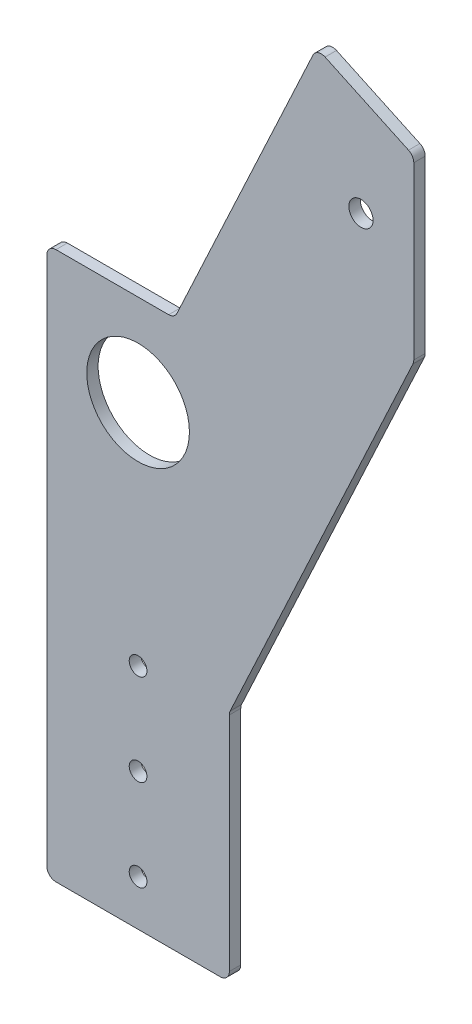
ISO-10303-21;
HEADER;
FILE_DESCRIPTION(('STEP AP214'),'2;1');
FILE_NAME('part.step','',(''),(''),'','','');
FILE_SCHEMA(('AUTOMOTIVE_DESIGN { 1 0 10303 214 1 1 1 1 }'));
ENDSEC;
DATA;
#1=APPLICATION_CONTEXT('core data for automotive mechanical design processes');
#2=APPLICATION_PROTOCOL_DEFINITION('international standard','automotive_design',2000,#1);
#3=PRODUCT_CONTEXT('',#1,'mechanical');
#4=PRODUCT('Part','Part','',(#3));
#5=PRODUCT_RELATED_PRODUCT_CATEGORY('part','',(#4));
#6=PRODUCT_DEFINITION_FORMATION('','',#4);
#7=PRODUCT_DEFINITION_CONTEXT('part definition',#1,'design');
#8=PRODUCT_DEFINITION('design','',#6,#7);
#9=PRODUCT_DEFINITION_SHAPE('','',#8);
#10=(LENGTH_UNIT() NAMED_UNIT(*) SI_UNIT(.MILLI.,.METRE.));
#11=(NAMED_UNIT(*) PLANE_ANGLE_UNIT() SI_UNIT($,.RADIAN.));
#12=(NAMED_UNIT(*) SI_UNIT($,.STERADIAN.) SOLID_ANGLE_UNIT());
#13=UNCERTAINTY_MEASURE_WITH_UNIT(LENGTH_MEASURE(1.E-05),#10,'distance_accuracy_value','');
#14=(GEOMETRIC_REPRESENTATION_CONTEXT(3) GLOBAL_UNCERTAINTY_ASSIGNED_CONTEXT((#13)) GLOBAL_UNIT_ASSIGNED_CONTEXT((#10,
#11,#12)) REPRESENTATION_CONTEXT('',''));
#15=CARTESIAN_POINT('',(0.,0.,0.));
#16=DIRECTION('',(0.,0.,1.));
#17=DIRECTION('',(1.,0.,0.));
#18=AXIS2_PLACEMENT_3D('',#15,#16,#17);
#19=CARTESIAN_POINT('',(0.,114.3,3.175));
#20=DIRECTION('',(0.,1.,0.));
#21=DIRECTION('',(0.,0.,1.));
#22=AXIS2_PLACEMENT_3D('',#19,#20,#21);
#23=PLANE('',#22);
#24=DIRECTION('',(1.,0.,0.));
#25=VECTOR('',#24,1.);
#26=CARTESIAN_POINT('',(0.,114.3,3.175));
#27=LINE('',#26,#25);
#28=CARTESIAN_POINT('',(-22.86,114.3,3.175));
#29=VERTEX_POINT('',#28);
#30=CARTESIAN_POINT('',(8.51448508895965,114.3,3.175));
#31=VERTEX_POINT('',#30);
#32=EDGE_CURVE('E273',#29,#31,#27,.T.);
#33=ORIENTED_EDGE('',*,*,#32,.T.);
#34=DIRECTION('',(0.,0.,-1.));
#35=VECTOR('',#34,1.);
#36=CARTESIAN_POINT('',(8.51448508895965,114.3,0.));
#37=LINE('',#36,#35);
#38=CARTESIAN_POINT('',(8.51448508895965,114.3,0.));
#39=VERTEX_POINT('',#38);
#40=EDGE_CURVE('E168',#31,#39,#37,.T.);
#41=ORIENTED_EDGE('',*,*,#40,.T.);
#42=DIRECTION('',(1.,0.,0.));
#43=VECTOR('',#42,1.);
#44=CARTESIAN_POINT('',(0.,114.3,0.));
#45=LINE('',#44,#43);
#46=CARTESIAN_POINT('',(-22.86,114.3,0.));
#47=VERTEX_POINT('',#46);
#48=EDGE_CURVE('E152',#47,#39,#45,.T.);
#49=ORIENTED_EDGE('',*,*,#48,.F.);
#50=DIRECTION('',(0.,0.,-1.));
#51=VECTOR('',#50,1.);
#52=CARTESIAN_POINT('',(-22.86,114.3,3.175));
#53=LINE('',#52,#51);
#54=EDGE_CURVE('E165',#47,#29,#53,.F.);
#55=ORIENTED_EDGE('',*,*,#54,.T.);
#56=EDGE_LOOP('',(#33,#41,#49,#55));
#57=FACE_BOUND('',#56,.T.);
#58=ADVANCED_FACE('F35',(#57),#23,.T.);
#59=CARTESIAN_POINT('',(-25.4,0.,3.175));
#60=DIRECTION('',(-1.,0.,0.));
#61=DIRECTION('',(0.,0.,1.));
#62=AXIS2_PLACEMENT_3D('',#59,#60,#61);
#63=PLANE('',#62);
#64=DIRECTION('',(0.,1.,0.));
#65=VECTOR('',#64,1.);
#66=CARTESIAN_POINT('',(-25.4,0.,3.175));
#67=LINE('',#66,#65);
#68=CARTESIAN_POINT('',(-25.4,-35.56,3.175));
#69=VERTEX_POINT('',#68);
#70=CARTESIAN_POINT('',(-25.4,111.76,3.175));
#71=VERTEX_POINT('',#70);
#72=EDGE_CURVE('E275',#69,#71,#67,.T.);
#73=ORIENTED_EDGE('',*,*,#72,.T.);
#74=DIRECTION('',(0.,0.,-1.));
#75=VECTOR('',#74,1.);
#76=CARTESIAN_POINT('',(-25.4,111.76,3.175));
#77=LINE('',#76,#75);
#78=CARTESIAN_POINT('',(-25.4,111.76,0.));
#79=VERTEX_POINT('',#78);
#80=EDGE_CURVE('E191',#71,#79,#77,.T.);
#81=ORIENTED_EDGE('',*,*,#80,.T.);
#82=DIRECTION('',(0.,1.,0.));
#83=VECTOR('',#82,1.);
#84=CARTESIAN_POINT('',(-25.4,0.,0.));
#85=LINE('',#84,#83);
#86=CARTESIAN_POINT('',(-25.4,-35.56,0.));
#87=VERTEX_POINT('',#86);
#88=EDGE_CURVE('E154',#87,#79,#85,.T.);
#89=ORIENTED_EDGE('',*,*,#88,.F.);
#90=DIRECTION('',(0.,0.,-1.));
#91=VECTOR('',#90,1.);
#92=CARTESIAN_POINT('',(-25.4,-35.56,3.175));
#93=LINE('',#92,#91);
#94=EDGE_CURVE('E189',#87,#69,#93,.F.);
#95=ORIENTED_EDGE('',*,*,#94,.T.);
#96=EDGE_LOOP('',(#73,#81,#89,#95));
#97=FACE_BOUND('',#96,.T.);
#98=ADVANCED_FACE('F300',(#97),#63,.T.);
#99=CARTESIAN_POINT('',(0.,-38.1,3.175));
#100=DIRECTION('',(0.,1.,0.));
#101=DIRECTION('',(0.,0.,1.));
#102=AXIS2_PLACEMENT_3D('',#99,#100,#101);
#103=PLANE('',#102);
#104=DIRECTION('',(1.,0.,0.));
#105=VECTOR('',#104,1.);
#106=CARTESIAN_POINT('',(0.,-38.1,3.175));
#107=LINE('',#106,#105);
#108=CARTESIAN_POINT('',(-22.86,-38.1,3.175));
#109=VERTEX_POINT('',#108);
#110=CARTESIAN_POINT('',(22.86,-38.1,3.175));
#111=VERTEX_POINT('',#110);
#112=EDGE_CURVE('E261',#109,#111,#107,.T.);
#113=ORIENTED_EDGE('',*,*,#112,.F.);
#114=DIRECTION('',(0.,0.,-1.));
#115=VECTOR('',#114,1.);
#116=CARTESIAN_POINT('',(-22.86,-38.1,0.));
#117=LINE('',#116,#115);
#118=CARTESIAN_POINT('',(-22.86,-38.1,0.));
#119=VERTEX_POINT('',#118);
#120=EDGE_CURVE('E213',#109,#119,#117,.T.);
#121=ORIENTED_EDGE('',*,*,#120,.T.);
#122=DIRECTION('',(1.,0.,0.));
#123=VECTOR('',#122,1.);
#124=CARTESIAN_POINT('',(0.,-38.1,0.));
#125=LINE('',#124,#123);
#126=CARTESIAN_POINT('',(22.86,-38.1,0.));
#127=VERTEX_POINT('',#126);
#128=EDGE_CURVE('E251',#119,#127,#125,.T.);
#129=ORIENTED_EDGE('',*,*,#128,.T.);
#130=DIRECTION('',(0.,0.,-1.));
#131=VECTOR('',#130,1.);
#132=CARTESIAN_POINT('',(22.86,-38.1,3.175));
#133=LINE('',#132,#131);
#134=EDGE_CURVE('E211',#127,#111,#133,.F.);
#135=ORIENTED_EDGE('',*,*,#134,.T.);
#136=EDGE_LOOP('',(#113,#121,#129,#135));
#137=FACE_BOUND('',#136,.T.);
#138=ADVANCED_FACE('F295',(#137),#103,.F.);
#139=CARTESIAN_POINT('',(25.4,0.,3.175));
#140=DIRECTION('',(-1.,0.,0.));
#141=DIRECTION('',(0.,0.,1.));
#142=AXIS2_PLACEMENT_3D('',#139,#140,#141);
#143=PLANE('',#142);
#144=DIRECTION('',(0.,1.,0.));
#145=VECTOR('',#144,1.);
#146=CARTESIAN_POINT('',(25.4,0.,3.175));
#147=LINE('',#146,#145);
#148=CARTESIAN_POINT('',(25.4,-35.56,3.175));
#149=VERTEX_POINT('',#148);
#150=CARTESIAN_POINT('',(25.4,26.2748066946256,3.175));
#151=VERTEX_POINT('',#150);
#152=EDGE_CURVE('E257',#149,#151,#147,.T.);
#153=ORIENTED_EDGE('',*,*,#152,.F.);
#154=DIRECTION('',(0.,0.,-1.));
#155=VECTOR('',#154,1.);
#156=CARTESIAN_POINT('',(25.4,-35.56,3.175));
#157=LINE('',#156,#155);
#158=CARTESIAN_POINT('',(25.4,-35.56,0.));
#159=VERTEX_POINT('',#158);
#160=EDGE_CURVE('E218',#149,#159,#157,.T.);
#161=ORIENTED_EDGE('',*,*,#160,.T.);
#162=DIRECTION('',(0.,1.,0.));
#163=VECTOR('',#162,1.);
#164=CARTESIAN_POINT('',(25.4,0.,0.));
#165=LINE('',#164,#163);
#166=CARTESIAN_POINT('',(25.4,26.2748066946256,0.));
#167=VERTEX_POINT('',#166);
#168=EDGE_CURVE('E241',#159,#167,#165,.T.);
#169=ORIENTED_EDGE('',*,*,#168,.T.);
#170=DIRECTION('',(0.,0.,-1.));
#171=VECTOR('',#170,1.);
#172=CARTESIAN_POINT('',(25.4,26.2748066946256,3.175));
#173=LINE('',#172,#171);
#174=EDGE_CURVE('E216',#167,#151,#173,.F.);
#175=ORIENTED_EDGE('',*,*,#174,.T.);
#176=EDGE_LOOP('',(#153,#161,#169,#175));
#177=FACE_BOUND('',#176,.T.);
#178=ADVANCED_FACE('F249',(#177),#143,.F.);
#179=CARTESIAN_POINT('',(10.5838862970263,-4.93534723334508,3.175));
#180=DIRECTION('',(-0.906307787036651,0.422618261740697,0.));
#181=DIRECTION('',(-0.422618261740697,-0.906307787036651,0.));
#182=AXIS2_PLACEMENT_3D('',#179,#180,#181);
#183=PLANE('',#182);
#184=DIRECTION('',(0.422618261740697,0.906307787036651,0.));
#185=VECTOR('',#184,1.);
#186=CARTESIAN_POINT('',(10.5838862970263,-4.93534723334508,3.175));
#187=LINE('',#186,#185);
#188=CARTESIAN_POINT('',(25.6379782209269,27.348257079447,3.175));
#189=VERTEX_POINT('',#188);
#190=CARTESIAN_POINT('',(76.4939842980309,136.409314061273,3.175));
#191=VERTEX_POINT('',#190);
#192=EDGE_CURVE('E256',#189,#191,#187,.T.);
#193=ORIENTED_EDGE('',*,*,#192,.F.);
#194=DIRECTION('',(0.,0.,-1.));
#195=VECTOR('',#194,1.);
#196=CARTESIAN_POINT('',(25.6379782209269,27.348257079447,0.));
#197=LINE('',#196,#195);
#198=CARTESIAN_POINT('',(25.6379782209269,27.348257079447,0.));
#199=VERTEX_POINT('',#198);
#200=EDGE_CURVE('E223',#189,#199,#197,.T.);
#201=ORIENTED_EDGE('',*,*,#200,.T.);
#202=DIRECTION('',(0.422618261740697,0.906307787036651,0.));
#203=VECTOR('',#202,1.);
#204=CARTESIAN_POINT('',(10.5838862970263,-4.93534723334508,0.));
#205=LINE('',#204,#203);
#206=CARTESIAN_POINT('',(76.4939842980309,136.409314061273,0.));
#207=VERTEX_POINT('',#206);
#208=EDGE_CURVE('E243',#199,#207,#205,.T.);
#209=ORIENTED_EDGE('',*,*,#208,.T.);
#210=DIRECTION('',(0.,0.,1.));
#211=VECTOR('',#210,1.);
#212=CARTESIAN_POINT('',(76.4939842980309,136.409314061273,3.175));
#213=LINE('',#212,#211);
#214=EDGE_CURVE('E221',#207,#191,#213,.T.);
#215=ORIENTED_EDGE('',*,*,#214,.T.);
#216=EDGE_LOOP('',(#193,#201,#209,#215));
#217=FACE_BOUND('',#216,.T.);
#218=ADVANCED_FACE('F255',(#217),#183,.F.);
#219=CARTESIAN_POINT('',(85.1980762219313,182.707864072034,3.175));
#220=DIRECTION('',(0.422618261740696,0.906307787036651,0.));
#221=DIRECTION('',(-0.906307787036651,0.422618261740696,0.));
#222=AXIS2_PLACEMENT_3D('',#219,#220,#221);
#223=PLANE('',#222);
#224=DIRECTION('',(0.906307787036651,-0.422618261740696,0.));
#225=VECTOR('',#224,1.);
#226=CARTESIAN_POINT('',(85.1980762219313,182.707864072034,3.175));
#227=LINE('',#226,#225);
#228=CARTESIAN_POINT('',(52.0435487165691,198.168074150295,3.175));
#229=VERTEX_POINT('',#228);
#230=CARTESIAN_POINT('',(75.2654129037792,187.339541043164,3.175));
#231=VERTEX_POINT('',#230);
#232=EDGE_CURVE('E179',#229,#231,#227,.T.);
#233=ORIENTED_EDGE('',*,*,#232,.T.);
#234=DIRECTION('',(0.,0.,1.));
#235=VECTOR('',#234,1.);
#236=CARTESIAN_POINT('',(75.2654129037792,187.339541043164,0.));
#237=LINE('',#236,#235);
#238=CARTESIAN_POINT('',(75.2654129037792,187.339541043164,0.));
#239=VERTEX_POINT('',#238);
#240=EDGE_CURVE('E233',#231,#239,#237,.F.);
#241=ORIENTED_EDGE('',*,*,#240,.T.);
#242=DIRECTION('',(0.906307787036651,-0.422618261740696,0.));
#243=VECTOR('',#242,1.);
#244=CARTESIAN_POINT('',(85.1980762219313,182.707864072034,0.));
#245=LINE('',#244,#243);
#246=CARTESIAN_POINT('',(52.0435487165691,198.168074150295,0.));
#247=VERTEX_POINT('',#246);
#248=EDGE_CURVE('E268',#247,#239,#245,.T.);
#249=ORIENTED_EDGE('',*,*,#248,.F.);
#250=DIRECTION('',(0.,0.,-1.));
#251=VECTOR('',#250,1.);
#252=CARTESIAN_POINT('',(52.0435487165691,198.168074150295,3.175));
#253=LINE('',#252,#251);
#254=EDGE_CURVE('E231',#247,#229,#253,.F.);
#255=ORIENTED_EDGE('',*,*,#254,.T.);
#256=EDGE_LOOP('',(#233,#241,#249,#255));
#257=FACE_BOUND('',#256,.T.);
#258=ADVANCED_FACE('F313',(#257),#223,.T.);
#259=CARTESIAN_POINT('',(-35.4565492844356,16.5336604630823,3.175));
#260=DIRECTION('',(-0.906307787036651,0.422618261740697,0.));
#261=DIRECTION('',(-0.422618261740697,-0.906307787036651,0.));
#262=AXIS2_PLACEMENT_3D('',#259,#260,#261);
#263=PLANE('',#262);
#264=DIRECTION('',(0.422618261740697,0.906307787036651,0.));
#265=VECTOR('',#264,1.);
#266=CARTESIAN_POINT('',(-35.4565492844356,16.5336604630823,0.));
#267=LINE('',#266,#265);
#268=CARTESIAN_POINT('',(10.8165068680327,115.766549615179,0.));
#269=VERTEX_POINT('',#268);
#270=CARTESIAN_POINT('',(48.6680765526746,196.939502756043,0.));
#271=VERTEX_POINT('',#270);
#272=EDGE_CURVE('E182',#269,#271,#267,.T.);
#273=ORIENTED_EDGE('',*,*,#272,.F.);
#274=DIRECTION('',(0.,0.,-1.));
#275=VECTOR('',#274,1.);
#276=CARTESIAN_POINT('',(10.8165068680327,115.766549615179,3.175));
#277=LINE('',#276,#275);
#278=CARTESIAN_POINT('',(10.8165068680327,115.766549615179,3.175));
#279=VERTEX_POINT('',#278);
#280=EDGE_CURVE('E187',#269,#279,#277,.F.);
#281=ORIENTED_EDGE('',*,*,#280,.T.);
#282=DIRECTION('',(0.422618261740697,0.906307787036651,0.));
#283=VECTOR('',#282,1.);
#284=CARTESIAN_POINT('',(-35.4565492844356,16.5336604630823,3.175));
#285=LINE('',#284,#283);
#286=CARTESIAN_POINT('',(48.6680765526746,196.939502756043,3.175));
#287=VERTEX_POINT('',#286);
#288=EDGE_CURVE('E174',#279,#287,#285,.T.);
#289=ORIENTED_EDGE('',*,*,#288,.T.);
#290=DIRECTION('',(0.,0.,-1.));
#291=VECTOR('',#290,1.);
#292=CARTESIAN_POINT('',(48.6680765526746,196.939502756043,3.175));
#293=LINE('',#292,#291);
#294=EDGE_CURVE('E176',#287,#271,#293,.T.);
#295=ORIENTED_EDGE('',*,*,#294,.T.);
#296=EDGE_LOOP('',(#273,#281,#289,#295));
#297=FACE_BOUND('',#296,.T.);
#298=ADVANCED_FACE('F307',(#297),#263,.T.);
#299=CARTESIAN_POINT('',(0.,0.,3.175));
#300=DIRECTION('',(0.,0.,1.));
#301=DIRECTION('',(1.,0.,0.));
#302=AXIS2_PLACEMENT_3D('',#299,#300,#301);
#303=PLANE('',#302);
#304=ORIENTED_EDGE('',*,*,#32,.F.);
#305=CARTESIAN_POINT('',(-22.86,111.76,3.175));
#306=DIRECTION('',(0.,0.,1.));
#307=DIRECTION('',(1.,0.,0.));
#308=AXIS2_PLACEMENT_3D('',#305,#306,#307);
#309=CIRCLE('',#308,2.54);
#310=EDGE_CURVE('E173',#29,#71,#309,.T.);
#311=ORIENTED_EDGE('',*,*,#310,.T.);
#312=ORIENTED_EDGE('',*,*,#72,.F.);
#313=CARTESIAN_POINT('',(-22.86,-35.56,3.175));
#314=DIRECTION('',(0.,0.,1.));
#315=DIRECTION('',(1.,0.,0.));
#316=AXIS2_PLACEMENT_3D('',#313,#314,#315);
#317=CIRCLE('',#316,2.54);
#318=EDGE_CURVE('E208',#69,#109,#317,.T.);
#319=ORIENTED_EDGE('',*,*,#318,.T.);
#320=ORIENTED_EDGE('',*,*,#112,.T.);
#321=CARTESIAN_POINT('',(22.86,-35.56,3.175));
#322=DIRECTION('',(0.,0.,1.));
#323=DIRECTION('',(1.,0.,0.));
#324=AXIS2_PLACEMENT_3D('',#321,#322,#323);
#325=CIRCLE('',#324,2.54);
#326=EDGE_CURVE('E206',#111,#149,#325,.T.);
#327=ORIENTED_EDGE('',*,*,#326,.T.);
#328=ORIENTED_EDGE('',*,*,#152,.T.);
#329=CARTESIAN_POINT('',(27.94,26.2748066946256,3.175));
#330=DIRECTION('',(0.,0.,1.));
#331=DIRECTION('',(1.,0.,0.));
#332=AXIS2_PLACEMENT_3D('',#329,#330,#331);
#333=CIRCLE('',#332,2.54);
#334=EDGE_CURVE('E11',#151,#189,#333,.F.);
#335=ORIENTED_EDGE('',*,*,#334,.T.);
#336=ORIENTED_EDGE('',*,*,#192,.T.);
#337=CARTESIAN_POINT('',(74.1919625189578,137.482764446095,3.175));
#338=DIRECTION('',(0.,0.,1.));
#339=DIRECTION('',(1.,0.,0.));
#340=AXIS2_PLACEMENT_3D('',#337,#338,#339);
#341=CIRCLE('',#340,2.54);
#342=CARTESIAN_POINT('',(76.7319625189578,137.482764446095,3.175));
#343=VERTEX_POINT('',#342);
#344=EDGE_CURVE('E50',#191,#343,#341,.T.);
#345=ORIENTED_EDGE('',*,*,#344,.T.);
#346=DIRECTION('',(0.,-1.,0.));
#347=VECTOR('',#346,1.);
#348=CARTESIAN_POINT('',(76.7319625189578,186.655677726542,3.175));
#349=LINE('',#348,#347);
#350=CARTESIAN_POINT('',(76.7319625189578,185.037519264091,3.175));
#351=VERTEX_POINT('',#350);
#352=EDGE_CURVE('E328',#351,#343,#349,.T.);
#353=ORIENTED_EDGE('',*,*,#352,.F.);
#354=CARTESIAN_POINT('',(74.1919625189578,185.037519264091,3.175));
#355=DIRECTION('',(0.,0.,1.));
#356=DIRECTION('',(1.,0.,0.));
#357=AXIS2_PLACEMENT_3D('',#354,#355,#356);
#358=CIRCLE('',#357,2.54);
#359=EDGE_CURVE('E203',#351,#231,#358,.T.);
#360=ORIENTED_EDGE('',*,*,#359,.T.);
#361=ORIENTED_EDGE('',*,*,#232,.F.);
#362=CARTESIAN_POINT('',(50.9700983317477,195.866052371222,3.175));
#363=DIRECTION('',(0.,0.,1.));
#364=DIRECTION('',(1.,0.,0.));
#365=AXIS2_PLACEMENT_3D('',#362,#363,#364);
#366=CIRCLE('',#365,2.54);
#367=EDGE_CURVE('E159',#229,#287,#366,.T.);
#368=ORIENTED_EDGE('',*,*,#367,.T.);
#369=ORIENTED_EDGE('',*,*,#288,.F.);
#370=CARTESIAN_POINT('',(8.51448508895965,116.84,3.175));
#371=DIRECTION('',(0.,0.,1.));
#372=DIRECTION('',(1.,0.,0.));
#373=AXIS2_PLACEMENT_3D('',#370,#371,#372);
#374=CIRCLE('',#373,2.54);
#375=EDGE_CURVE('E237',#279,#31,#374,.F.);
#376=ORIENTED_EDGE('',*,*,#375,.T.);
#377=EDGE_LOOP('',(#304,#311,#312,#319,#320,#327,#328,#335,#336,#345,#353,#360,#361,#368,#369,#376));
#378=FACE_BOUND('',#377,.T.);
#379=CARTESIAN_POINT('',(3.33066907387547E-12,88.9000000000015,3.175));
#380=DIRECTION('',(0.,0.,1.));
#381=DIRECTION('',(1.,0.,0.));
#382=AXIS2_PLACEMENT_3D('',#379,#380,#381);
#383=CIRCLE('',#382,14.2875);
#384=CARTESIAN_POINT('',(14.2875000000033,88.9000000000015,3.175));
#385=VERTEX_POINT('',#384);
#386=EDGE_CURVE('E327',#385,#385,#383,.T.);
#387=ORIENTED_EDGE('',*,*,#386,.F.);
#388=EDGE_LOOP('',(#387));
#389=FACE_BOUND('',#388,.T.);
#390=CARTESIAN_POINT('',(0.,0.,3.175));
#391=DIRECTION('',(0.,0.,1.));
#392=DIRECTION('',(1.,0.,0.));
#393=AXIS2_PLACEMENT_3D('',#390,#391,#392);
#394=CIRCLE('',#393,2.4638);
#395=CARTESIAN_POINT('',(2.4638,0.,3.175));
#396=VERTEX_POINT('',#395);
#397=EDGE_CURVE('E342',#396,#396,#394,.T.);
#398=ORIENTED_EDGE('',*,*,#397,.F.);
#399=EDGE_LOOP('',(#398));
#400=FACE_BOUND('',#399,.T.);
#401=CARTESIAN_POINT('',(0.,25.4,3.175));
#402=DIRECTION('',(0.,0.,1.));
#403=DIRECTION('',(1.,0.,0.));
#404=AXIS2_PLACEMENT_3D('',#401,#402,#403);
#405=CIRCLE('',#404,2.4638);
#406=CARTESIAN_POINT('',(2.4638,25.4,3.175));
#407=VERTEX_POINT('',#406);
#408=EDGE_CURVE('E336',#407,#407,#405,.T.);
#409=ORIENTED_EDGE('',*,*,#408,.F.);
#410=EDGE_LOOP('',(#409));
#411=FACE_BOUND('',#410,.T.);
#412=CARTESIAN_POINT('',(0.,-25.4,3.175));
#413=DIRECTION('',(0.,0.,1.));
#414=DIRECTION('',(1.,0.,0.));
#415=AXIS2_PLACEMENT_3D('',#412,#413,#414);
#416=CIRCLE('',#415,2.4638);
#417=CARTESIAN_POINT('',(2.4638,-25.4,3.175));
#418=VERTEX_POINT('',#417);
#419=EDGE_CURVE('E341',#418,#418,#416,.T.);
#420=ORIENTED_EDGE('',*,*,#419,.F.);
#421=EDGE_LOOP('',(#420));
#422=FACE_BOUND('',#421,.T.);
#423=CARTESIAN_POINT('',(62.0272408800131,165.486802896172,3.175));
#424=DIRECTION('',(0.,0.,1.));
#425=DIRECTION('',(1.,0.,0.));
#426=AXIS2_PLACEMENT_3D('',#423,#424,#425);
#427=CIRCLE('',#426,3.37343749999999);
#428=CARTESIAN_POINT('',(65.4006783800131,165.486802896172,3.175));
#429=VERTEX_POINT('',#428);
#430=EDGE_CURVE('E280',#429,#429,#427,.T.);
#431=ORIENTED_EDGE('',*,*,#430,.F.);
#432=EDGE_LOOP('',(#431));
#433=FACE_BOUND('',#432,.T.);
#434=ADVANCED_FACE('F285',(#378,#389,#400,#411,#422,#433),#303,.T.);
#435=CARTESIAN_POINT('',(0.,0.,0.));
#436=DIRECTION('',(0.,0.,1.));
#437=DIRECTION('',(1.,0.,0.));
#438=AXIS2_PLACEMENT_3D('',#435,#436,#437);
#439=PLANE('',#438);
#440=CARTESIAN_POINT('',(3.33066907387547E-12,88.9000000000015,0.));
#441=DIRECTION('',(0.,0.,1.));
#442=DIRECTION('',(1.,0.,0.));
#443=AXIS2_PLACEMENT_3D('',#440,#441,#442);
#444=CIRCLE('',#443,14.2875);
#445=CARTESIAN_POINT('',(14.2875000000033,88.9000000000015,0.));
#446=VERTEX_POINT('',#445);
#447=EDGE_CURVE('E331',#446,#446,#444,.T.);
#448=ORIENTED_EDGE('',*,*,#447,.T.);
#449=EDGE_LOOP('',(#448));
#450=FACE_BOUND('',#449,.T.);
#451=CARTESIAN_POINT('',(0.,0.,0.));
#452=DIRECTION('',(0.,0.,1.));
#453=DIRECTION('',(1.,0.,0.));
#454=AXIS2_PLACEMENT_3D('',#451,#452,#453);
#455=CIRCLE('',#454,2.4638);
#456=CARTESIAN_POINT('',(2.4638,0.,0.));
#457=VERTEX_POINT('',#456);
#458=EDGE_CURVE('E338',#457,#457,#455,.T.);
#459=ORIENTED_EDGE('',*,*,#458,.T.);
#460=EDGE_LOOP('',(#459));
#461=FACE_BOUND('',#460,.T.);
#462=CARTESIAN_POINT('',(0.,25.4,0.));
#463=DIRECTION('',(0.,0.,1.));
#464=DIRECTION('',(1.,0.,0.));
#465=AXIS2_PLACEMENT_3D('',#462,#463,#464);
#466=CIRCLE('',#465,2.4638);
#467=CARTESIAN_POINT('',(2.4638,25.4,0.));
#468=VERTEX_POINT('',#467);
#469=EDGE_CURVE('E345',#468,#468,#466,.T.);
#470=ORIENTED_EDGE('',*,*,#469,.T.);
#471=EDGE_LOOP('',(#470));
#472=FACE_BOUND('',#471,.T.);
#473=CARTESIAN_POINT('',(0.,-25.4,0.));
#474=DIRECTION('',(0.,0.,1.));
#475=DIRECTION('',(1.,0.,0.));
#476=AXIS2_PLACEMENT_3D('',#473,#474,#475);
#477=CIRCLE('',#476,2.4638);
#478=CARTESIAN_POINT('',(2.4638,-25.4,0.));
#479=VERTEX_POINT('',#478);
#480=EDGE_CURVE('E350',#479,#479,#477,.T.);
#481=ORIENTED_EDGE('',*,*,#480,.T.);
#482=EDGE_LOOP('',(#481));
#483=FACE_BOUND('',#482,.T.);
#484=CARTESIAN_POINT('',(62.0272408800131,165.486802896172,0.));
#485=DIRECTION('',(0.,0.,1.));
#486=DIRECTION('',(1.,0.,0.));
#487=AXIS2_PLACEMENT_3D('',#484,#485,#486);
#488=CIRCLE('',#487,3.37343749999999);
#489=CARTESIAN_POINT('',(65.4006783800131,165.486802896172,0.));
#490=VERTEX_POINT('',#489);
#491=EDGE_CURVE('E169',#490,#490,#488,.T.);
#492=ORIENTED_EDGE('',*,*,#491,.T.);
#493=EDGE_LOOP('',(#492));
#494=FACE_BOUND('',#493,.T.);
#495=ORIENTED_EDGE('',*,*,#88,.T.);
#496=CARTESIAN_POINT('',(-22.86,111.76,0.));
#497=DIRECTION('',(0.,0.,1.));
#498=DIRECTION('',(1.,0.,0.));
#499=AXIS2_PLACEMENT_3D('',#496,#497,#498);
#500=CIRCLE('',#499,2.54);
#501=EDGE_CURVE('E149',#79,#47,#500,.F.);
#502=ORIENTED_EDGE('',*,*,#501,.T.);
#503=ORIENTED_EDGE('',*,*,#48,.T.);
#504=CARTESIAN_POINT('',(8.51448508895965,116.84,0.));
#505=DIRECTION('',(0.,0.,1.));
#506=DIRECTION('',(1.,0.,0.));
#507=AXIS2_PLACEMENT_3D('',#504,#505,#506);
#508=CIRCLE('',#507,2.54);
#509=EDGE_CURVE('E235',#39,#269,#508,.T.);
#510=ORIENTED_EDGE('',*,*,#509,.T.);
#511=ORIENTED_EDGE('',*,*,#272,.T.);
#512=CARTESIAN_POINT('',(50.9700983317477,195.866052371222,0.));
#513=DIRECTION('',(0.,0.,1.));
#514=DIRECTION('',(1.,0.,0.));
#515=AXIS2_PLACEMENT_3D('',#512,#513,#514);
#516=CIRCLE('',#515,2.54);
#517=EDGE_CURVE('E193',#271,#247,#516,.F.);
#518=ORIENTED_EDGE('',*,*,#517,.T.);
#519=ORIENTED_EDGE('',*,*,#248,.T.);
#520=CARTESIAN_POINT('',(74.1919625189578,185.037519264091,0.));
#521=DIRECTION('',(0.,0.,1.));
#522=DIRECTION('',(1.,0.,0.));
#523=AXIS2_PLACEMENT_3D('',#520,#521,#522);
#524=CIRCLE('',#523,2.54);
#525=CARTESIAN_POINT('',(76.7319625189578,185.037519264091,0.));
#526=VERTEX_POINT('',#525);
#527=EDGE_CURVE('E195',#239,#526,#524,.F.);
#528=ORIENTED_EDGE('',*,*,#527,.T.);
#529=DIRECTION('',(0.,-1.,0.));
#530=VECTOR('',#529,1.);
#531=CARTESIAN_POINT('',(76.7319625189578,186.655677726542,0.));
#532=LINE('',#531,#530);
#533=CARTESIAN_POINT('',(76.7319625189578,137.482764446095,0.));
#534=VERTEX_POINT('',#533);
#535=EDGE_CURVE('E321',#526,#534,#532,.T.);
#536=ORIENTED_EDGE('',*,*,#535,.T.);
#537=CARTESIAN_POINT('',(74.1919625189578,137.482764446095,0.));
#538=DIRECTION('',(0.,0.,1.));
#539=DIRECTION('',(1.,0.,0.));
#540=AXIS2_PLACEMENT_3D('',#537,#538,#539);
#541=CIRCLE('',#540,2.54);
#542=EDGE_CURVE('E197',#534,#207,#541,.F.);
#543=ORIENTED_EDGE('',*,*,#542,.T.);
#544=ORIENTED_EDGE('',*,*,#208,.F.);
#545=CARTESIAN_POINT('',(27.94,26.2748066946256,0.));
#546=DIRECTION('',(0.,0.,1.));
#547=DIRECTION('',(1.,0.,0.));
#548=AXIS2_PLACEMENT_3D('',#545,#546,#547);
#549=CIRCLE('',#548,2.54);
#550=EDGE_CURVE('E43',#199,#167,#549,.T.);
#551=ORIENTED_EDGE('',*,*,#550,.T.);
#552=ORIENTED_EDGE('',*,*,#168,.F.);
#553=CARTESIAN_POINT('',(22.86,-35.56,0.));
#554=DIRECTION('',(0.,0.,1.));
#555=DIRECTION('',(1.,0.,0.));
#556=AXIS2_PLACEMENT_3D('',#553,#554,#555);
#557=CIRCLE('',#556,2.54);
#558=EDGE_CURVE('E199',#159,#127,#557,.F.);
#559=ORIENTED_EDGE('',*,*,#558,.T.);
#560=ORIENTED_EDGE('',*,*,#128,.F.);
#561=CARTESIAN_POINT('',(-22.86,-35.56,0.));
#562=DIRECTION('',(0.,0.,1.));
#563=DIRECTION('',(1.,0.,0.));
#564=AXIS2_PLACEMENT_3D('',#561,#562,#563);
#565=CIRCLE('',#564,2.54);
#566=EDGE_CURVE('E160',#119,#87,#565,.F.);
#567=ORIENTED_EDGE('',*,*,#566,.T.);
#568=EDGE_LOOP('',(#495,#502,#503,#510,#511,#518,#519,#528,#536,#543,#544,#551,#552,#559,#560,#567));
#569=FACE_BOUND('',#568,.T.);
#570=ADVANCED_FACE('F151',(#450,#461,#472,#483,#494,#569),#439,.F.);
#571=CARTESIAN_POINT('',(62.0272408800131,165.486802896172,0.));
#572=DIRECTION('',(0.,0.,1.));
#573=DIRECTION('',(1.,0.,0.));
#574=AXIS2_PLACEMENT_3D('',#571,#572,#573);
#575=CYLINDRICAL_SURFACE('',#574,3.37343749999999);
#576=ORIENTED_EDGE('',*,*,#491,.F.);
#577=EDGE_LOOP('',(#576));
#578=FACE_BOUND('',#577,.T.);
#579=ORIENTED_EDGE('',*,*,#430,.T.);
#580=EDGE_LOOP('',(#579));
#581=FACE_BOUND('',#580,.T.);
#582=ADVANCED_FACE('F360',(#578,#581),#575,.F.);
#583=CARTESIAN_POINT('',(0.,-25.4,0.));
#584=DIRECTION('',(0.,0.,1.));
#585=DIRECTION('',(1.,0.,0.));
#586=AXIS2_PLACEMENT_3D('',#583,#584,#585);
#587=CYLINDRICAL_SURFACE('',#586,2.4638);
#588=ORIENTED_EDGE('',*,*,#480,.F.);
#589=EDGE_LOOP('',(#588));
#590=FACE_BOUND('',#589,.T.);
#591=ORIENTED_EDGE('',*,*,#419,.T.);
#592=EDGE_LOOP('',(#591));
#593=FACE_BOUND('',#592,.T.);
#594=ADVANCED_FACE('F536',(#590,#593),#587,.F.);
#595=CARTESIAN_POINT('',(0.,25.4,0.));
#596=DIRECTION('',(0.,0.,1.));
#597=DIRECTION('',(1.,0.,0.));
#598=AXIS2_PLACEMENT_3D('',#595,#596,#597);
#599=CYLINDRICAL_SURFACE('',#598,2.4638);
#600=ORIENTED_EDGE('',*,*,#469,.F.);
#601=EDGE_LOOP('',(#600));
#602=FACE_BOUND('',#601,.T.);
#603=ORIENTED_EDGE('',*,*,#408,.T.);
#604=EDGE_LOOP('',(#603));
#605=FACE_BOUND('',#604,.T.);
#606=ADVANCED_FACE('F526',(#602,#605),#599,.F.);
#607=CARTESIAN_POINT('',(0.,0.,0.));
#608=DIRECTION('',(0.,0.,1.));
#609=DIRECTION('',(1.,0.,0.));
#610=AXIS2_PLACEMENT_3D('',#607,#608,#609);
#611=CYLINDRICAL_SURFACE('',#610,2.4638);
#612=ORIENTED_EDGE('',*,*,#458,.F.);
#613=EDGE_LOOP('',(#612));
#614=FACE_BOUND('',#613,.T.);
#615=ORIENTED_EDGE('',*,*,#397,.T.);
#616=EDGE_LOOP('',(#615));
#617=FACE_BOUND('',#616,.T.);
#618=ADVANCED_FACE('F516',(#614,#617),#611,.F.);
#619=CARTESIAN_POINT('',(3.33066907387547E-12,88.9000000000015,0.));
#620=DIRECTION('',(0.,0.,1.));
#621=DIRECTION('',(1.,0.,0.));
#622=AXIS2_PLACEMENT_3D('',#619,#620,#621);
#623=CYLINDRICAL_SURFACE('',#622,14.2875);
#624=ORIENTED_EDGE('',*,*,#447,.F.);
#625=EDGE_LOOP('',(#624));
#626=FACE_BOUND('',#625,.T.);
#627=ORIENTED_EDGE('',*,*,#386,.T.);
#628=EDGE_LOOP('',(#627));
#629=FACE_BOUND('',#628,.T.);
#630=ADVANCED_FACE('F447',(#626,#629),#623,.F.);
#631=CARTESIAN_POINT('',(76.7319625189578,186.655677726542,0.));
#632=DIRECTION('',(-1.,0.,0.));
#633=DIRECTION('',(0.,0.,1.));
#634=AXIS2_PLACEMENT_3D('',#631,#632,#633);
#635=PLANE('',#634);
#636=ORIENTED_EDGE('',*,*,#352,.T.);
#637=DIRECTION('',(0.,0.,1.));
#638=VECTOR('',#637,1.);
#639=CARTESIAN_POINT('',(76.7319625189578,137.482764446095,0.));
#640=LINE('',#639,#638);
#641=EDGE_CURVE('E229',#343,#534,#640,.F.);
#642=ORIENTED_EDGE('',*,*,#641,.T.);
#643=ORIENTED_EDGE('',*,*,#535,.F.);
#644=DIRECTION('',(0.,0.,1.));
#645=VECTOR('',#644,1.);
#646=CARTESIAN_POINT('',(76.7319625189578,185.037519264091,3.175));
#647=LINE('',#646,#645);
#648=EDGE_CURVE('E226',#526,#351,#647,.T.);
#649=ORIENTED_EDGE('',*,*,#648,.T.);
#650=EDGE_LOOP('',(#636,#642,#643,#649));
#651=FACE_BOUND('',#650,.T.);
#652=ADVANCED_FACE('F325',(#651),#635,.F.);
#653=CARTESIAN_POINT('',(8.51448508895965,116.84,3.175));
#654=DIRECTION('',(0.,0.,1.));
#655=DIRECTION('',(1.,0.,0.));
#656=AXIS2_PLACEMENT_3D('',#653,#654,#655);
#657=CYLINDRICAL_SURFACE('',#656,2.54);
#658=ORIENTED_EDGE('',*,*,#375,.F.);
#659=ORIENTED_EDGE('',*,*,#280,.F.);
#660=ORIENTED_EDGE('',*,*,#509,.F.);
#661=ORIENTED_EDGE('',*,*,#40,.F.);
#662=EDGE_LOOP('',(#658,#659,#660,#661));
#663=FACE_BOUND('',#662,.T.);
#664=ADVANCED_FACE('F305',(#663),#657,.F.);
#665=CARTESIAN_POINT('',(-22.86,111.76,3.175));
#666=DIRECTION('',(0.,0.,-1.));
#667=DIRECTION('',(-1.,0.,0.));
#668=AXIS2_PLACEMENT_3D('',#665,#666,#667);
#669=CYLINDRICAL_SURFACE('',#668,2.54);
#670=ORIENTED_EDGE('',*,*,#310,.F.);
#671=ORIENTED_EDGE('',*,*,#54,.F.);
#672=ORIENTED_EDGE('',*,*,#501,.F.);
#673=ORIENTED_EDGE('',*,*,#80,.F.);
#674=EDGE_LOOP('',(#670,#671,#672,#673));
#675=FACE_BOUND('',#674,.T.);
#676=ADVANCED_FACE('F172',(#675),#669,.T.);
#677=CARTESIAN_POINT('',(-22.86,-35.56,3.175));
#678=DIRECTION('',(0.,0.,1.));
#679=DIRECTION('',(1.,0.,0.));
#680=AXIS2_PLACEMENT_3D('',#677,#678,#679);
#681=CYLINDRICAL_SURFACE('',#680,2.54);
#682=ORIENTED_EDGE('',*,*,#318,.F.);
#683=ORIENTED_EDGE('',*,*,#94,.F.);
#684=ORIENTED_EDGE('',*,*,#566,.F.);
#685=ORIENTED_EDGE('',*,*,#120,.F.);
#686=EDGE_LOOP('',(#682,#683,#684,#685));
#687=FACE_BOUND('',#686,.T.);
#688=ADVANCED_FACE('F297',(#687),#681,.T.);
#689=CARTESIAN_POINT('',(22.86,-35.56,3.175));
#690=DIRECTION('',(0.,0.,-1.));
#691=DIRECTION('',(-1.,0.,0.));
#692=AXIS2_PLACEMENT_3D('',#689,#690,#691);
#693=CYLINDRICAL_SURFACE('',#692,2.54);
#694=ORIENTED_EDGE('',*,*,#326,.F.);
#695=ORIENTED_EDGE('',*,*,#134,.F.);
#696=ORIENTED_EDGE('',*,*,#558,.F.);
#697=ORIENTED_EDGE('',*,*,#160,.F.);
#698=EDGE_LOOP('',(#694,#695,#696,#697));
#699=FACE_BOUND('',#698,.T.);
#700=ADVANCED_FACE('F293',(#699),#693,.T.);
#701=CARTESIAN_POINT('',(27.94,26.2748066946256,3.175));
#702=DIRECTION('',(0.,0.,1.));
#703=DIRECTION('',(1.,0.,0.));
#704=AXIS2_PLACEMENT_3D('',#701,#702,#703);
#705=CYLINDRICAL_SURFACE('',#704,2.54);
#706=ORIENTED_EDGE('',*,*,#334,.F.);
#707=ORIENTED_EDGE('',*,*,#174,.F.);
#708=ORIENTED_EDGE('',*,*,#550,.F.);
#709=ORIENTED_EDGE('',*,*,#200,.F.);
#710=EDGE_LOOP('',(#706,#707,#708,#709));
#711=FACE_BOUND('',#710,.T.);
#712=ADVANCED_FACE('F253',(#711),#705,.F.);
#713=CARTESIAN_POINT('',(74.1919625189578,137.482764446095,3.175));
#714=DIRECTION('',(0.,0.,1.));
#715=DIRECTION('',(1.,0.,0.));
#716=AXIS2_PLACEMENT_3D('',#713,#714,#715);
#717=CYLINDRICAL_SURFACE('',#716,2.54);
#718=ORIENTED_EDGE('',*,*,#542,.F.);
#719=ORIENTED_EDGE('',*,*,#641,.F.);
#720=ORIENTED_EDGE('',*,*,#344,.F.);
#721=ORIENTED_EDGE('',*,*,#214,.F.);
#722=EDGE_LOOP('',(#718,#719,#720,#721));
#723=FACE_BOUND('',#722,.T.);
#724=ADVANCED_FACE('F390',(#723),#717,.T.);
#725=CARTESIAN_POINT('',(74.1919625189578,185.037519264091,0.));
#726=DIRECTION('',(0.,0.,-1.));
#727=DIRECTION('',(-1.,0.,0.));
#728=AXIS2_PLACEMENT_3D('',#725,#726,#727);
#729=CYLINDRICAL_SURFACE('',#728,2.54);
#730=ORIENTED_EDGE('',*,*,#527,.F.);
#731=ORIENTED_EDGE('',*,*,#240,.F.);
#732=ORIENTED_EDGE('',*,*,#359,.F.);
#733=ORIENTED_EDGE('',*,*,#648,.F.);
#734=EDGE_LOOP('',(#730,#731,#732,#733));
#735=FACE_BOUND('',#734,.T.);
#736=ADVANCED_FACE('F317',(#735),#729,.T.);
#737=CARTESIAN_POINT('',(50.9700983317477,195.866052371222,3.175));
#738=DIRECTION('',(0.,0.,-1.));
#739=DIRECTION('',(-1.,0.,0.));
#740=AXIS2_PLACEMENT_3D('',#737,#738,#739);
#741=CYLINDRICAL_SURFACE('',#740,2.54);
#742=ORIENTED_EDGE('',*,*,#367,.F.);
#743=ORIENTED_EDGE('',*,*,#254,.F.);
#744=ORIENTED_EDGE('',*,*,#517,.F.);
#745=ORIENTED_EDGE('',*,*,#294,.F.);
#746=EDGE_LOOP('',(#742,#743,#744,#745));
#747=FACE_BOUND('',#746,.T.);
#748=ADVANCED_FACE('F37',(#747),#741,.T.);
#749=CLOSED_SHELL('',(#58,#98,#138,#178,#218,#258,#298,#434,#570,#582,#594,#606,#618,#630,#652,
#664,#676,#688,#700,#712,#724,#736,#748));
#750=MANIFOLD_SOLID_BREP('B2',#749);
#751=ADVANCED_BREP_SHAPE_REPRESENTATION('',(#18,#750),#14);
#752=SHAPE_DEFINITION_REPRESENTATION(#9,#751);
ENDSEC;
END-ISO-10303-21;
